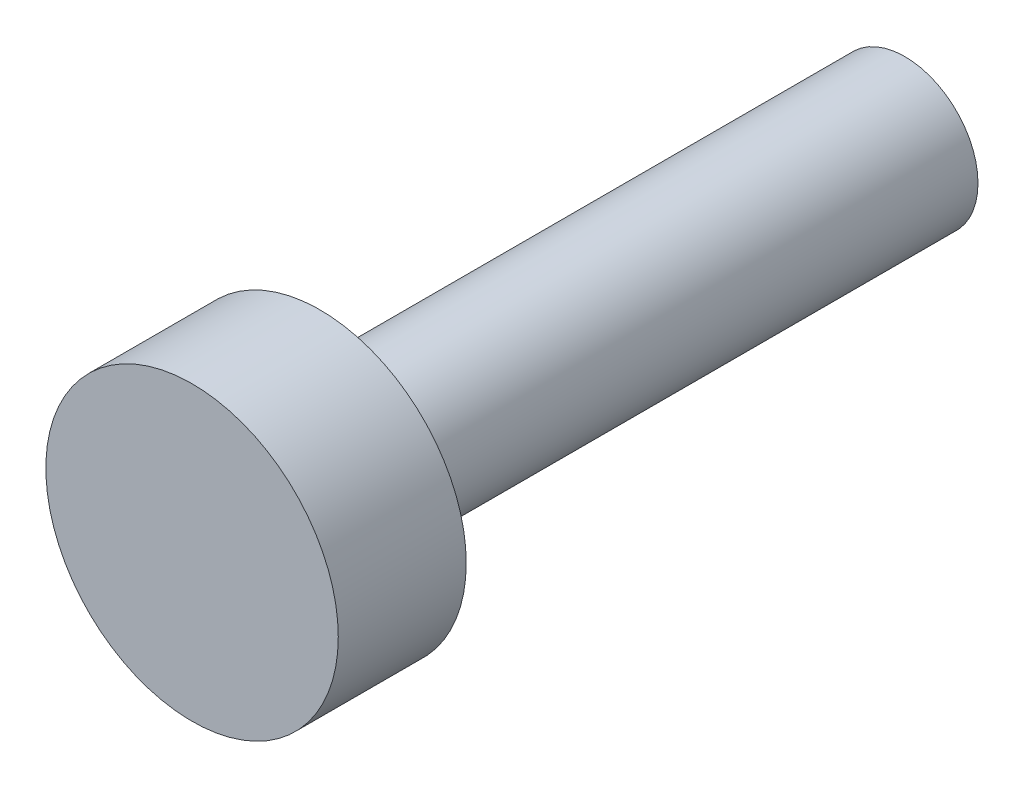
ISO-10303-21;
HEADER;
FILE_DESCRIPTION(('STEP AP214'),'2;1');
FILE_NAME('part.step','',(''),(''),'','','');
FILE_SCHEMA(('AUTOMOTIVE_DESIGN { 1 0 10303 214 1 1 1 1 }'));
ENDSEC;
DATA;
#1=APPLICATION_CONTEXT('core data for automotive mechanical design processes');
#2=APPLICATION_PROTOCOL_DEFINITION('international standard','automotive_design',2000,#1);
#3=PRODUCT_CONTEXT('',#1,'mechanical');
#4=PRODUCT('Part','Part','',(#3));
#5=PRODUCT_RELATED_PRODUCT_CATEGORY('part','',(#4));
#6=PRODUCT_DEFINITION_FORMATION('','',#4);
#7=PRODUCT_DEFINITION_CONTEXT('part definition',#1,'design');
#8=PRODUCT_DEFINITION('design','',#6,#7);
#9=PRODUCT_DEFINITION_SHAPE('','',#8);
#10=(LENGTH_UNIT() NAMED_UNIT(*) SI_UNIT(.MILLI.,.METRE.));
#11=(NAMED_UNIT(*) PLANE_ANGLE_UNIT() SI_UNIT($,.RADIAN.));
#12=(NAMED_UNIT(*) SI_UNIT($,.STERADIAN.) SOLID_ANGLE_UNIT());
#13=UNCERTAINTY_MEASURE_WITH_UNIT(LENGTH_MEASURE(1.E-05),#10,'distance_accuracy_value','');
#14=(GEOMETRIC_REPRESENTATION_CONTEXT(3) GLOBAL_UNCERTAINTY_ASSIGNED_CONTEXT((#13)) GLOBAL_UNIT_ASSIGNED_CONTEXT((#10,
#11,#12)) REPRESENTATION_CONTEXT('',''));
#15=CARTESIAN_POINT('',(0.,0.,0.));
#16=DIRECTION('',(0.,0.,1.));
#17=DIRECTION('',(1.,0.,0.));
#18=AXIS2_PLACEMENT_3D('',#15,#16,#17);
#19=CARTESIAN_POINT('',(0.,0.,16.));
#20=DIRECTION('',(0.,0.,-1.));
#21=DIRECTION('',(-1.,0.,0.));
#22=AXIS2_PLACEMENT_3D('',#19,#20,#21);
#23=CYLINDRICAL_SURFACE('',#22,2.);
#24=CARTESIAN_POINT('',(0.,0.,16.));
#25=DIRECTION('',(0.,0.,1.));
#26=DIRECTION('',(1.,0.,0.));
#27=AXIS2_PLACEMENT_3D('',#24,#25,#26);
#28=CIRCLE('',#27,2.);
#29=CARTESIAN_POINT('',(2.,0.,16.));
#30=VERTEX_POINT('',#29);
#31=EDGE_CURVE('E10',#30,#30,#28,.T.);
#32=ORIENTED_EDGE('',*,*,#31,.F.);
#33=EDGE_LOOP('',(#32));
#34=FACE_BOUND('',#33,.T.);
#35=CARTESIAN_POINT('',(0.,0.,0.));
#36=DIRECTION('',(0.,0.,1.));
#37=DIRECTION('',(1.,0.,0.));
#38=AXIS2_PLACEMENT_3D('',#35,#36,#37);
#39=CIRCLE('',#38,2.);
#40=CARTESIAN_POINT('',(2.,0.,0.));
#41=VERTEX_POINT('',#40);
#42=EDGE_CURVE('E34',#41,#41,#39,.T.);
#43=ORIENTED_EDGE('',*,*,#42,.T.);
#44=EDGE_LOOP('',(#43));
#45=FACE_BOUND('',#44,.T.);
#46=ADVANCED_FACE('F31',(#34,#45),#23,.T.);
#47=CARTESIAN_POINT('',(0.,0.,0.));
#48=DIRECTION('',(0.,0.,1.));
#49=DIRECTION('',(1.,0.,0.));
#50=AXIS2_PLACEMENT_3D('',#47,#48,#49);
#51=PLANE('',#50);
#52=ORIENTED_EDGE('',*,*,#42,.F.);
#53=EDGE_LOOP('',(#52));
#54=FACE_BOUND('',#53,.T.);
#55=ADVANCED_FACE('F54',(#54),#51,.F.);
#56=CARTESIAN_POINT('',(0.,0.,19.5));
#57=DIRECTION('',(0.,0.,-1.));
#58=DIRECTION('',(-1.,0.,0.));
#59=AXIS2_PLACEMENT_3D('',#56,#57,#58);
#60=CYLINDRICAL_SURFACE('',#59,4.);
#61=CARTESIAN_POINT('',(0.,0.,19.5));
#62=DIRECTION('',(0.,0.,1.));
#63=DIRECTION('',(1.,0.,0.));
#64=AXIS2_PLACEMENT_3D('',#61,#62,#63);
#65=CIRCLE('',#64,4.);
#66=CARTESIAN_POINT('',(4.,0.,19.5));
#67=VERTEX_POINT('',#66);
#68=EDGE_CURVE('E41',#67,#67,#65,.T.);
#69=ORIENTED_EDGE('',*,*,#68,.F.);
#70=EDGE_LOOP('',(#69));
#71=FACE_BOUND('',#70,.T.);
#72=CARTESIAN_POINT('',(0.,0.,16.));
#73=DIRECTION('',(0.,0.,1.));
#74=DIRECTION('',(1.,0.,0.));
#75=AXIS2_PLACEMENT_3D('',#72,#73,#74);
#76=CIRCLE('',#75,4.);
#77=CARTESIAN_POINT('',(4.,0.,16.));
#78=VERTEX_POINT('',#77);
#79=EDGE_CURVE('E43',#78,#78,#76,.T.);
#80=ORIENTED_EDGE('',*,*,#79,.T.);
#81=EDGE_LOOP('',(#80));
#82=FACE_BOUND('',#81,.T.);
#83=ADVANCED_FACE('F51',(#71,#82),#60,.T.);
#84=CARTESIAN_POINT('',(0.,0.,19.5));
#85=DIRECTION('',(0.,0.,1.));
#86=DIRECTION('',(1.,0.,0.));
#87=AXIS2_PLACEMENT_3D('',#84,#85,#86);
#88=PLANE('',#87);
#89=ORIENTED_EDGE('',*,*,#68,.T.);
#90=EDGE_LOOP('',(#89));
#91=FACE_BOUND('',#90,.T.);
#92=ADVANCED_FACE('F49',(#91),#88,.T.);
#93=CARTESIAN_POINT('',(0.,0.,16.));
#94=DIRECTION('',(0.,0.,1.));
#95=DIRECTION('',(1.,0.,0.));
#96=AXIS2_PLACEMENT_3D('',#93,#94,#95);
#97=PLANE('',#96);
#98=ORIENTED_EDGE('',*,*,#31,.T.);
#99=EDGE_LOOP('',(#98));
#100=FACE_BOUND('',#99,.T.);
#101=ORIENTED_EDGE('',*,*,#79,.F.);
#102=EDGE_LOOP('',(#101));
#103=FACE_BOUND('',#102,.T.);
#104=ADVANCED_FACE('F58',(#100,#103),#97,.F.);
#105=CLOSED_SHELL('',(#46,#55,#83,#92,#104));
#106=MANIFOLD_SOLID_BREP('B2',#105);
#107=ADVANCED_BREP_SHAPE_REPRESENTATION('',(#18,#106),#14);
#108=SHAPE_DEFINITION_REPRESENTATION(#9,#107);
ENDSEC;
END-ISO-10303-21;
